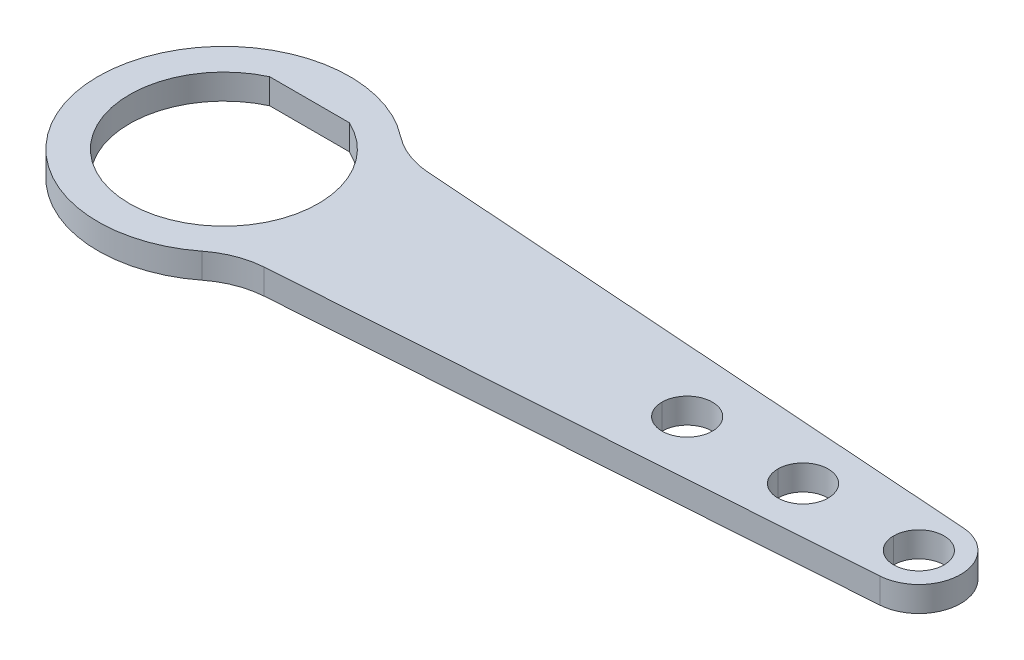
ISO-10303-21;
HEADER;
FILE_DESCRIPTION(('STEP AP214'),'2;1');
FILE_NAME('part.step','',(''),(''),'','','');
FILE_SCHEMA(('AUTOMOTIVE_DESIGN { 1 0 10303 214 1 1 1 1 }'));
ENDSEC;
DATA;
#1=APPLICATION_CONTEXT('core data for automotive mechanical design processes');
#2=APPLICATION_PROTOCOL_DEFINITION('international standard','automotive_design',2000,#1);
#3=PRODUCT_CONTEXT('',#1,'mechanical');
#4=PRODUCT('Part','Part','',(#3));
#5=PRODUCT_RELATED_PRODUCT_CATEGORY('part','',(#4));
#6=PRODUCT_DEFINITION_FORMATION('','',#4);
#7=PRODUCT_DEFINITION_CONTEXT('part definition',#1,'design');
#8=PRODUCT_DEFINITION('design','',#6,#7);
#9=PRODUCT_DEFINITION_SHAPE('','',#8);
#10=(LENGTH_UNIT() NAMED_UNIT(*) SI_UNIT(.MILLI.,.METRE.));
#11=(NAMED_UNIT(*) PLANE_ANGLE_UNIT() SI_UNIT($,.RADIAN.));
#12=(NAMED_UNIT(*) SI_UNIT($,.STERADIAN.) SOLID_ANGLE_UNIT());
#13=UNCERTAINTY_MEASURE_WITH_UNIT(LENGTH_MEASURE(1.E-05),#10,'distance_accuracy_value','');
#14=(GEOMETRIC_REPRESENTATION_CONTEXT(3) GLOBAL_UNCERTAINTY_ASSIGNED_CONTEXT((#13)) GLOBAL_UNIT_ASSIGNED_CONTEXT((#10,
#11,#12)) REPRESENTATION_CONTEXT('',''));
#15=CARTESIAN_POINT('',(0.,0.,0.));
#16=DIRECTION('',(0.,0.,1.));
#17=DIRECTION('',(1.,0.,0.));
#18=AXIS2_PLACEMENT_3D('',#15,#16,#17);
#19=CARTESIAN_POINT('',(70.104,2.54,0.));
#20=DIRECTION('',(0.,-1.,0.));
#21=DIRECTION('',(0.,0.,-1.));
#22=AXIS2_PLACEMENT_3D('',#19,#20,#21);
#23=CYLINDRICAL_SURFACE('',#22,2.54);
#24=CARTESIAN_POINT('',(70.104,2.54,0.));
#25=DIRECTION('',(0.,1.,0.));
#26=DIRECTION('',(0.,0.,1.));
#27=AXIS2_PLACEMENT_3D('',#24,#25,#26);
#28=CIRCLE('',#27,2.54);
#29=CARTESIAN_POINT('',(72.644,2.54,0.));
#30=VERTEX_POINT('',#29);
#31=CARTESIAN_POINT('',(67.564,2.54,0.));
#32=VERTEX_POINT('',#31);
#33=EDGE_CURVE('E187',#30,#32,#28,.T.);
#34=ORIENTED_EDGE('',*,*,#33,.T.);
#35=DIRECTION('',(0.,-1.,0.));
#36=VECTOR('',#35,1.);
#37=CARTESIAN_POINT('',(67.564,2.54,0.));
#38=LINE('',#37,#36);
#39=CARTESIAN_POINT('',(67.564,0.,0.));
#40=VERTEX_POINT('',#39);
#41=EDGE_CURVE('E11',#32,#40,#38,.T.);
#42=ORIENTED_EDGE('',*,*,#41,.T.);
#43=CARTESIAN_POINT('',(70.104,0.,0.));
#44=DIRECTION('',(0.,1.,0.));
#45=DIRECTION('',(0.,0.,1.));
#46=AXIS2_PLACEMENT_3D('',#43,#44,#45);
#47=CIRCLE('',#46,2.54);
#48=CARTESIAN_POINT('',(72.644,0.,0.));
#49=VERTEX_POINT('',#48);
#50=EDGE_CURVE('E192',#49,#40,#47,.T.);
#51=ORIENTED_EDGE('',*,*,#50,.F.);
#52=DIRECTION('',(0.,-1.,0.));
#53=VECTOR('',#52,1.);
#54=CARTESIAN_POINT('',(72.644,2.54,0.));
#55=LINE('',#54,#53);
#56=EDGE_CURVE('E60',#49,#30,#55,.F.);
#57=ORIENTED_EDGE('',*,*,#56,.T.);
#58=EDGE_LOOP('',(#34,#42,#51,#57));
#59=FACE_BOUND('',#58,.T.);
#60=ADVANCED_FACE('F51',(#59),#23,.F.);
#61=CARTESIAN_POINT('',(58.42,2.54,0.));
#62=DIRECTION('',(0.,-1.,0.));
#63=DIRECTION('',(0.,0.,-1.));
#64=AXIS2_PLACEMENT_3D('',#61,#62,#63);
#65=CYLINDRICAL_SURFACE('',#64,2.54);
#66=CARTESIAN_POINT('',(58.42,2.54,0.));
#67=DIRECTION('',(0.,1.,0.));
#68=DIRECTION('',(0.,0.,1.));
#69=AXIS2_PLACEMENT_3D('',#66,#67,#68);
#70=CIRCLE('',#69,2.54);
#71=CARTESIAN_POINT('',(60.96,2.54,0.));
#72=VERTEX_POINT('',#71);
#73=CARTESIAN_POINT('',(55.88,2.54,0.));
#74=VERTEX_POINT('',#73);
#75=EDGE_CURVE('E196',#72,#74,#70,.T.);
#76=ORIENTED_EDGE('',*,*,#75,.T.);
#77=DIRECTION('',(0.,-1.,0.));
#78=VECTOR('',#77,1.);
#79=CARTESIAN_POINT('',(55.88,2.54,0.));
#80=LINE('',#79,#78);
#81=CARTESIAN_POINT('',(55.88,0.,0.));
#82=VERTEX_POINT('',#81);
#83=EDGE_CURVE('E281',#74,#82,#80,.T.);
#84=ORIENTED_EDGE('',*,*,#83,.T.);
#85=CARTESIAN_POINT('',(58.42,0.,0.));
#86=DIRECTION('',(0.,1.,0.));
#87=DIRECTION('',(0.,0.,1.));
#88=AXIS2_PLACEMENT_3D('',#85,#86,#87);
#89=CIRCLE('',#88,2.54);
#90=CARTESIAN_POINT('',(60.96,0.,0.));
#91=VERTEX_POINT('',#90);
#92=EDGE_CURVE('E202',#91,#82,#89,.T.);
#93=ORIENTED_EDGE('',*,*,#92,.F.);
#94=DIRECTION('',(0.,-1.,0.));
#95=VECTOR('',#94,1.);
#96=CARTESIAN_POINT('',(60.96,2.54,0.));
#97=LINE('',#96,#95);
#98=EDGE_CURVE('E278',#91,#72,#97,.F.);
#99=ORIENTED_EDGE('',*,*,#98,.T.);
#100=EDGE_LOOP('',(#76,#84,#93,#99));
#101=FACE_BOUND('',#100,.T.);
#102=ADVANCED_FACE('F371',(#101),#65,.F.);
#103=CARTESIAN_POINT('',(46.736,2.54,0.));
#104=DIRECTION('',(0.,-1.,0.));
#105=DIRECTION('',(0.,0.,-1.));
#106=AXIS2_PLACEMENT_3D('',#103,#104,#105);
#107=CYLINDRICAL_SURFACE('',#106,2.54);
#108=CARTESIAN_POINT('',(46.736,2.54,0.));
#109=DIRECTION('',(0.,1.,0.));
#110=DIRECTION('',(0.,0.,1.));
#111=AXIS2_PLACEMENT_3D('',#108,#109,#110);
#112=CIRCLE('',#111,2.54);
#113=CARTESIAN_POINT('',(49.276,2.54,0.));
#114=VERTEX_POINT('',#113);
#115=CARTESIAN_POINT('',(44.196,2.54,0.));
#116=VERTEX_POINT('',#115);
#117=EDGE_CURVE('E177',#114,#116,#112,.T.);
#118=ORIENTED_EDGE('',*,*,#117,.T.);
#119=DIRECTION('',(0.,-1.,0.));
#120=VECTOR('',#119,1.);
#121=CARTESIAN_POINT('',(44.196,2.54,0.));
#122=LINE('',#121,#120);
#123=CARTESIAN_POINT('',(44.196,0.,0.));
#124=VERTEX_POINT('',#123);
#125=EDGE_CURVE('E275',#116,#124,#122,.T.);
#126=ORIENTED_EDGE('',*,*,#125,.T.);
#127=CARTESIAN_POINT('',(46.736,0.,0.));
#128=DIRECTION('',(0.,1.,0.));
#129=DIRECTION('',(0.,0.,1.));
#130=AXIS2_PLACEMENT_3D('',#127,#128,#129);
#131=CIRCLE('',#130,2.54);
#132=CARTESIAN_POINT('',(49.276,0.,0.));
#133=VERTEX_POINT('',#132);
#134=EDGE_CURVE('E183',#133,#124,#131,.T.);
#135=ORIENTED_EDGE('',*,*,#134,.F.);
#136=DIRECTION('',(0.,-1.,0.));
#137=VECTOR('',#136,1.);
#138=CARTESIAN_POINT('',(49.276,2.54,0.));
#139=LINE('',#138,#137);
#140=EDGE_CURVE('E272',#133,#114,#139,.F.);
#141=ORIENTED_EDGE('',*,*,#140,.T.);
#142=EDGE_LOOP('',(#118,#126,#135,#141));
#143=FACE_BOUND('',#142,.T.);
#144=ADVANCED_FACE('F293',(#143),#107,.F.);
#145=CARTESIAN_POINT('',(12.9091275552743,2.54,-16.523789327436));
#146=DIRECTION('',(0.,-1.,0.));
#147=DIRECTION('',(0.,0.,-1.));
#148=AXIS2_PLACEMENT_3D('',#145,#146,#147);
#149=PLANE('',#148);
#150=ORIENTED_EDGE('',*,*,#117,.F.);
#151=EDGE_CURVE('E182',#116,#114,#112,.T.);
#152=ORIENTED_EDGE('',*,*,#151,.F.);
#153=EDGE_LOOP('',(#150,#152));
#154=FACE_BOUND('',#153,.T.);
#155=ORIENTED_EDGE('',*,*,#33,.F.);
#156=EDGE_CURVE('E191',#32,#30,#28,.T.);
#157=ORIENTED_EDGE('',*,*,#156,.F.);
#158=EDGE_LOOP('',(#155,#157));
#159=FACE_BOUND('',#158,.T.);
#160=ORIENTED_EDGE('',*,*,#75,.F.);
#161=EDGE_CURVE('E201',#74,#72,#70,.T.);
#162=ORIENTED_EDGE('',*,*,#161,.F.);
#163=EDGE_LOOP('',(#160,#162));
#164=FACE_BOUND('',#163,.T.);
#165=CARTESIAN_POINT('',(12.9091275552743,2.54,-16.523789327436));
#166=DIRECTION('',(0.,-1.,0.));
#167=DIRECTION('',(0.,0.,-1.));
#168=AXIS2_PLACEMENT_3D('',#165,#166,#167);
#169=CIRCLE('',#168,8.26857620287629);
#170=CARTESIAN_POINT('',(12.33145930283,2.54,-8.27541665078699));
#171=VERTEX_POINT('',#170);
#172=CARTESIAN_POINT('',(7.81864816980252,2.54,-10.0079338925097));
#173=VERTEX_POINT('',#172);
#174=EDGE_CURVE('E206',#171,#173,#169,.T.);
#175=ORIENTED_EDGE('',*,*,#174,.T.);
#176=CARTESIAN_POINT('',(0.,2.54,0.));
#177=DIRECTION('',(0.,1.,0.));
#178=DIRECTION('',(0.,0.,-1.));
#179=AXIS2_PLACEMENT_3D('',#176,#177,#178);
#180=CIRCLE('',#179,12.7);
#181=CARTESIAN_POINT('',(7.81864816980252,2.54,10.0079338925097));
#182=VERTEX_POINT('',#181);
#183=EDGE_CURVE('E210',#173,#182,#180,.T.);
#184=ORIENTED_EDGE('',*,*,#183,.T.);
#185=CARTESIAN_POINT('',(12.9091275552743,2.54,16.523789327436));
#186=DIRECTION('',(0.,-1.,0.));
#187=DIRECTION('',(0.,0.,1.));
#188=AXIS2_PLACEMENT_3D('',#185,#186,#187);
#189=CIRCLE('',#188,8.26857620287629);
#190=CARTESIAN_POINT('',(12.33145930283,2.54,8.27541665078699));
#191=VERTEX_POINT('',#190);
#192=EDGE_CURVE('E214',#182,#191,#189,.T.);
#193=ORIENTED_EDGE('',*,*,#192,.T.);
#194=DIRECTION('',(0.997556589462132,0.,-0.0698630862521835));
#195=VECTOR('',#194,1.);
#196=CARTESIAN_POINT('',(70.3987543461835,2.54,4.20871959830985));
#197=LINE('',#196,#195);
#198=CARTESIAN_POINT('',(70.3987543461835,2.54,4.20871959830985));
#199=VERTEX_POINT('',#198);
#200=EDGE_CURVE('E217',#191,#199,#197,.T.);
#201=ORIENTED_EDGE('',*,*,#200,.T.);
#202=CARTESIAN_POINT('',(70.104,2.54,0.));
#203=DIRECTION('',(0.,1.,0.));
#204=DIRECTION('',(0.,0.,-1.));
#205=AXIS2_PLACEMENT_3D('',#202,#203,#204);
#206=CIRCLE('',#205,4.21902841680303);
#207=CARTESIAN_POINT('',(70.3987543461835,2.54,-4.20871959830985));
#208=VERTEX_POINT('',#207);
#209=EDGE_CURVE('E220',#199,#208,#206,.T.);
#210=ORIENTED_EDGE('',*,*,#209,.T.);
#211=DIRECTION('',(-0.997556589462132,0.,-0.0698630862521835));
#212=VECTOR('',#211,1.);
#213=CARTESIAN_POINT('',(70.3987543461835,2.54,-4.20871959830985));
#214=LINE('',#213,#212);
#215=EDGE_CURVE('E223',#208,#171,#214,.T.);
#216=ORIENTED_EDGE('',*,*,#215,.T.);
#217=EDGE_LOOP('',(#175,#184,#193,#201,#210,#216));
#218=FACE_BOUND('',#217,.T.);
#219=CARTESIAN_POINT('',(0.,2.54,0.));
#220=DIRECTION('',(0.,1.,0.));
#221=DIRECTION('',(0.,0.,-1.));
#222=AXIS2_PLACEMENT_3D('',#219,#220,#221);
#223=CIRCLE('',#222,9.525);
#224=CARTESIAN_POINT('',(-4.01810017296732,2.54,-8.636));
#225=VERTEX_POINT('',#224);
#226=CARTESIAN_POINT('',(4.01810017296732,2.54,-8.636));
#227=VERTEX_POINT('',#226);
#228=EDGE_CURVE('E161',#225,#227,#223,.T.);
#229=ORIENTED_EDGE('',*,*,#228,.F.);
#230=DIRECTION('',(-1.,0.,0.));
#231=VECTOR('',#230,1.);
#232=CARTESIAN_POINT('',(-4.01810017296732,2.54,-8.636));
#233=LINE('',#232,#231);
#234=EDGE_CURVE('E150',#227,#225,#233,.T.);
#235=ORIENTED_EDGE('',*,*,#234,.F.);
#236=EDGE_LOOP('',(#229,#235));
#237=FACE_BOUND('',#236,.T.);
#238=ADVANCED_FACE('F170',(#154,#159,#164,#218,#237),#149,.F.);
#239=CARTESIAN_POINT('',(12.9091275552743,0.,-16.523789327436));
#240=DIRECTION('',(0.,-1.,0.));
#241=DIRECTION('',(0.,0.,-1.));
#242=AXIS2_PLACEMENT_3D('',#239,#240,#241);
#243=PLANE('',#242);
#244=ORIENTED_EDGE('',*,*,#50,.T.);
#245=EDGE_CURVE('E181',#40,#49,#47,.T.);
#246=ORIENTED_EDGE('',*,*,#245,.T.);
#247=EDGE_LOOP('',(#244,#246));
#248=FACE_BOUND('',#247,.T.);
#249=CARTESIAN_POINT('',(12.9091275552743,0.,-16.523789327436));
#250=DIRECTION('',(0.,-1.,0.));
#251=DIRECTION('',(0.,0.,-1.));
#252=AXIS2_PLACEMENT_3D('',#249,#250,#251);
#253=CIRCLE('',#252,8.26857620287629);
#254=CARTESIAN_POINT('',(12.33145930283,0.,-8.27541665078699));
#255=VERTEX_POINT('',#254);
#256=CARTESIAN_POINT('',(7.81864816980252,0.,-10.0079338925097));
#257=VERTEX_POINT('',#256);
#258=EDGE_CURVE('E200',#255,#257,#253,.T.);
#259=ORIENTED_EDGE('',*,*,#258,.F.);
#260=DIRECTION('',(-0.997556589462132,0.,-0.0698630862521835));
#261=VECTOR('',#260,1.);
#262=CARTESIAN_POINT('',(70.3987543461835,0.,-4.20871959830985));
#263=LINE('',#262,#261);
#264=CARTESIAN_POINT('',(70.3987543461835,0.,-4.20871959830985));
#265=VERTEX_POINT('',#264);
#266=EDGE_CURVE('E211',#265,#255,#263,.T.);
#267=ORIENTED_EDGE('',*,*,#266,.F.);
#268=CARTESIAN_POINT('',(70.104,0.,0.));
#269=DIRECTION('',(0.,1.,0.));
#270=DIRECTION('',(0.,0.,-1.));
#271=AXIS2_PLACEMENT_3D('',#268,#269,#270);
#272=CIRCLE('',#271,4.21902841680303);
#273=CARTESIAN_POINT('',(70.3987543461835,0.,4.20871959830985));
#274=VERTEX_POINT('',#273);
#275=EDGE_CURVE('E239',#274,#265,#272,.T.);
#276=ORIENTED_EDGE('',*,*,#275,.F.);
#277=DIRECTION('',(0.997556589462132,0.,-0.0698630862521835));
#278=VECTOR('',#277,1.);
#279=CARTESIAN_POINT('',(70.3987543461835,0.,4.20871959830985));
#280=LINE('',#279,#278);
#281=CARTESIAN_POINT('',(12.33145930283,0.,8.27541665078699));
#282=VERTEX_POINT('',#281);
#283=EDGE_CURVE('E236',#282,#274,#280,.T.);
#284=ORIENTED_EDGE('',*,*,#283,.F.);
#285=CARTESIAN_POINT('',(12.9091275552743,0.,16.523789327436));
#286=DIRECTION('',(0.,-1.,0.));
#287=DIRECTION('',(0.,0.,1.));
#288=AXIS2_PLACEMENT_3D('',#285,#286,#287);
#289=CIRCLE('',#288,8.26857620287629);
#290=CARTESIAN_POINT('',(7.81864816980252,0.,10.0079338925097));
#291=VERTEX_POINT('',#290);
#292=EDGE_CURVE('E233',#291,#282,#289,.T.);
#293=ORIENTED_EDGE('',*,*,#292,.F.);
#294=CARTESIAN_POINT('',(0.,0.,0.));
#295=DIRECTION('',(0.,1.,0.));
#296=DIRECTION('',(0.,0.,-1.));
#297=AXIS2_PLACEMENT_3D('',#294,#295,#296);
#298=CIRCLE('',#297,12.7);
#299=EDGE_CURVE('E230',#257,#291,#298,.T.);
#300=ORIENTED_EDGE('',*,*,#299,.F.);
#301=EDGE_LOOP('',(#259,#267,#276,#284,#293,#300));
#302=FACE_BOUND('',#301,.T.);
#303=ORIENTED_EDGE('',*,*,#92,.T.);
#304=EDGE_CURVE('E190',#82,#91,#89,.T.);
#305=ORIENTED_EDGE('',*,*,#304,.T.);
#306=EDGE_LOOP('',(#303,#305));
#307=FACE_BOUND('',#306,.T.);
#308=ORIENTED_EDGE('',*,*,#134,.T.);
#309=EDGE_CURVE('E175',#124,#133,#131,.T.);
#310=ORIENTED_EDGE('',*,*,#309,.T.);
#311=EDGE_LOOP('',(#308,#310));
#312=FACE_BOUND('',#311,.T.);
#313=DIRECTION('',(1.,0.,0.));
#314=VECTOR('',#313,1.);
#315=CARTESIAN_POINT('',(12.9091275552743,0.,-8.636));
#316=LINE('',#315,#314);
#317=CARTESIAN_POINT('',(4.01810017296732,0.,-8.636));
#318=VERTEX_POINT('',#317);
#319=CARTESIAN_POINT('',(-4.01810017296732,0.,-8.636));
#320=VERTEX_POINT('',#319);
#321=EDGE_CURVE('E267',#318,#320,#316,.F.);
#322=ORIENTED_EDGE('',*,*,#321,.T.);
#323=CARTESIAN_POINT('',(0.,0.,0.));
#324=DIRECTION('',(0.,-1.,0.));
#325=DIRECTION('',(0.,0.,-1.));
#326=AXIS2_PLACEMENT_3D('',#323,#324,#325);
#327=CIRCLE('',#326,9.525);
#328=EDGE_CURVE('E166',#320,#318,#327,.F.);
#329=ORIENTED_EDGE('',*,*,#328,.T.);
#330=EDGE_LOOP('',(#322,#329));
#331=FACE_BOUND('',#330,.T.);
#332=ADVANCED_FACE('F292',(#248,#302,#307,#312,#331),#243,.T.);
#333=CARTESIAN_POINT('',(12.9091275552743,2.54,-16.523789327436));
#334=DIRECTION('',(0.,-1.,0.));
#335=DIRECTION('',(0.,0.,-1.));
#336=AXIS2_PLACEMENT_3D('',#333,#334,#335);
#337=CYLINDRICAL_SURFACE('',#336,8.26857620287629);
#338=ORIENTED_EDGE('',*,*,#258,.T.);
#339=DIRECTION('',(0.,-1.,0.));
#340=VECTOR('',#339,1.);
#341=CARTESIAN_POINT('',(7.81864816980252,2.54,-10.0079338925097));
#342=LINE('',#341,#340);
#343=EDGE_CURVE('E263',#173,#257,#342,.T.);
#344=ORIENTED_EDGE('',*,*,#343,.F.);
#345=ORIENTED_EDGE('',*,*,#174,.F.);
#346=DIRECTION('',(0.,-1.,0.));
#347=VECTOR('',#346,1.);
#348=CARTESIAN_POINT('',(12.33145930283,2.54,-8.27541665078699));
#349=LINE('',#348,#347);
#350=EDGE_CURVE('E226',#171,#255,#349,.T.);
#351=ORIENTED_EDGE('',*,*,#350,.T.);
#352=EDGE_LOOP('',(#338,#344,#345,#351));
#353=FACE_BOUND('',#352,.T.);
#354=ADVANCED_FACE('F53',(#353),#337,.F.);
#355=CARTESIAN_POINT('',(0.,2.54,0.));
#356=DIRECTION('',(0.,-1.,0.));
#357=DIRECTION('',(0.,0.,-1.));
#358=AXIS2_PLACEMENT_3D('',#355,#356,#357);
#359=CYLINDRICAL_SURFACE('',#358,12.7);
#360=ORIENTED_EDGE('',*,*,#299,.T.);
#361=DIRECTION('',(0.,-1.,0.));
#362=VECTOR('',#361,1.);
#363=CARTESIAN_POINT('',(7.81864816980252,2.54,10.0079338925097));
#364=LINE('',#363,#362);
#365=EDGE_CURVE('E259',#182,#291,#364,.T.);
#366=ORIENTED_EDGE('',*,*,#365,.F.);
#367=ORIENTED_EDGE('',*,*,#183,.F.);
#368=ORIENTED_EDGE('',*,*,#343,.T.);
#369=EDGE_LOOP('',(#360,#366,#367,#368));
#370=FACE_BOUND('',#369,.T.);
#371=ADVANCED_FACE('F307',(#370),#359,.T.);
#372=CARTESIAN_POINT('',(12.9091275552743,2.54,16.523789327436));
#373=DIRECTION('',(0.,-1.,0.));
#374=DIRECTION('',(0.,0.,-1.));
#375=AXIS2_PLACEMENT_3D('',#372,#373,#374);
#376=CYLINDRICAL_SURFACE('',#375,8.26857620287629);
#377=ORIENTED_EDGE('',*,*,#292,.T.);
#378=DIRECTION('',(0.,-1.,0.));
#379=VECTOR('',#378,1.);
#380=CARTESIAN_POINT('',(12.33145930283,2.54,8.27541665078699));
#381=LINE('',#380,#379);
#382=EDGE_CURVE('E255',#191,#282,#381,.T.);
#383=ORIENTED_EDGE('',*,*,#382,.F.);
#384=ORIENTED_EDGE('',*,*,#192,.F.);
#385=ORIENTED_EDGE('',*,*,#365,.T.);
#386=EDGE_LOOP('',(#377,#383,#384,#385));
#387=FACE_BOUND('',#386,.T.);
#388=ADVANCED_FACE('F312',(#387),#376,.F.);
#389=CARTESIAN_POINT('',(70.3987543461835,2.54,4.20871959830985));
#390=DIRECTION('',(-0.0698630862521835,0.,-0.997556589462132));
#391=DIRECTION('',(-0.997556589462132,0.,0.0698630862521835));
#392=AXIS2_PLACEMENT_3D('',#389,#390,#391);
#393=PLANE('',#392);
#394=ORIENTED_EDGE('',*,*,#283,.T.);
#395=DIRECTION('',(0.,-1.,0.));
#396=VECTOR('',#395,1.);
#397=CARTESIAN_POINT('',(70.3987543461835,2.54,4.20871959830985));
#398=LINE('',#397,#396);
#399=EDGE_CURVE('E251',#199,#274,#398,.T.);
#400=ORIENTED_EDGE('',*,*,#399,.F.);
#401=ORIENTED_EDGE('',*,*,#200,.F.);
#402=ORIENTED_EDGE('',*,*,#382,.T.);
#403=EDGE_LOOP('',(#394,#400,#401,#402));
#404=FACE_BOUND('',#403,.T.);
#405=ADVANCED_FACE('F318',(#404),#393,.F.);
#406=CARTESIAN_POINT('',(70.104,2.54,0.));
#407=DIRECTION('',(0.,-1.,0.));
#408=DIRECTION('',(0.,0.,-1.));
#409=AXIS2_PLACEMENT_3D('',#406,#407,#408);
#410=CYLINDRICAL_SURFACE('',#409,4.21902841680303);
#411=ORIENTED_EDGE('',*,*,#275,.T.);
#412=DIRECTION('',(0.,-1.,0.));
#413=VECTOR('',#412,1.);
#414=CARTESIAN_POINT('',(70.3987543461835,2.54,-4.20871959830985));
#415=LINE('',#414,#413);
#416=EDGE_CURVE('E247',#208,#265,#415,.T.);
#417=ORIENTED_EDGE('',*,*,#416,.F.);
#418=ORIENTED_EDGE('',*,*,#209,.F.);
#419=ORIENTED_EDGE('',*,*,#399,.T.);
#420=EDGE_LOOP('',(#411,#417,#418,#419));
#421=FACE_BOUND('',#420,.T.);
#422=ADVANCED_FACE('F322',(#421),#410,.T.);
#423=CARTESIAN_POINT('',(70.3987543461835,2.54,-4.20871959830985));
#424=DIRECTION('',(-0.0698630862521835,0.,0.997556589462132));
#425=DIRECTION('',(0.997556589462132,0.,0.0698630862521835));
#426=AXIS2_PLACEMENT_3D('',#423,#424,#425);
#427=PLANE('',#426);
#428=ORIENTED_EDGE('',*,*,#266,.T.);
#429=ORIENTED_EDGE('',*,*,#350,.F.);
#430=ORIENTED_EDGE('',*,*,#215,.F.);
#431=ORIENTED_EDGE('',*,*,#416,.T.);
#432=EDGE_LOOP('',(#428,#429,#430,#431));
#433=FACE_BOUND('',#432,.T.);
#434=ADVANCED_FACE('F325',(#433),#427,.F.);
#435=ORIENTED_EDGE('',*,*,#83,.F.);
#436=ORIENTED_EDGE('',*,*,#161,.T.);
#437=ORIENTED_EDGE('',*,*,#98,.F.);
#438=ORIENTED_EDGE('',*,*,#304,.F.);
#439=EDGE_LOOP('',(#435,#436,#437,#438));
#440=FACE_BOUND('',#439,.T.);
#441=ADVANCED_FACE('F368',(#440),#65,.F.);
#442=ORIENTED_EDGE('',*,*,#41,.F.);
#443=ORIENTED_EDGE('',*,*,#156,.T.);
#444=ORIENTED_EDGE('',*,*,#56,.F.);
#445=ORIENTED_EDGE('',*,*,#245,.F.);
#446=EDGE_LOOP('',(#442,#443,#444,#445));
#447=FACE_BOUND('',#446,.T.);
#448=ADVANCED_FACE('F287',(#447),#23,.F.);
#449=ORIENTED_EDGE('',*,*,#125,.F.);
#450=ORIENTED_EDGE('',*,*,#151,.T.);
#451=ORIENTED_EDGE('',*,*,#140,.F.);
#452=ORIENTED_EDGE('',*,*,#309,.F.);
#453=EDGE_LOOP('',(#449,#450,#451,#452));
#454=FACE_BOUND('',#453,.T.);
#455=ADVANCED_FACE('F343',(#454),#107,.F.);
#456=CARTESIAN_POINT('',(0.,2.54,0.));
#457=DIRECTION('',(0.,-1.,0.));
#458=DIRECTION('',(0.,0.,-1.));
#459=AXIS2_PLACEMENT_3D('',#456,#457,#458);
#460=CYLINDRICAL_SURFACE('',#459,9.525);
#461=DIRECTION('',(0.,-1.,0.));
#462=VECTOR('',#461,1.);
#463=CARTESIAN_POINT('',(-4.01810017296732,2.54,-8.636));
#464=LINE('',#463,#462);
#465=EDGE_CURVE('E153',#225,#320,#464,.T.);
#466=ORIENTED_EDGE('',*,*,#465,.F.);
#467=ORIENTED_EDGE('',*,*,#228,.T.);
#468=DIRECTION('',(0.,-1.,0.));
#469=VECTOR('',#468,1.);
#470=CARTESIAN_POINT('',(4.01810017296732,2.54,-8.636));
#471=LINE('',#470,#469);
#472=EDGE_CURVE('E156',#227,#318,#471,.T.);
#473=ORIENTED_EDGE('',*,*,#472,.T.);
#474=ORIENTED_EDGE('',*,*,#328,.F.);
#475=EDGE_LOOP('',(#466,#467,#473,#474));
#476=FACE_BOUND('',#475,.T.);
#477=ADVANCED_FACE('F164',(#476),#460,.F.);
#478=CARTESIAN_POINT('',(-4.01810017296732,2.54,-8.636));
#479=DIRECTION('',(0.,0.,1.));
#480=DIRECTION('',(1.,0.,0.));
#481=AXIS2_PLACEMENT_3D('',#478,#479,#480);
#482=PLANE('',#481);
#483=ORIENTED_EDGE('',*,*,#472,.F.);
#484=ORIENTED_EDGE('',*,*,#234,.T.);
#485=ORIENTED_EDGE('',*,*,#465,.T.);
#486=ORIENTED_EDGE('',*,*,#321,.F.);
#487=EDGE_LOOP('',(#483,#484,#485,#486));
#488=FACE_BOUND('',#487,.T.);
#489=ADVANCED_FACE('F152',(#488),#482,.T.);
#490=CLOSED_SHELL('',(#60,#102,#144,#238,#332,#354,#371,#388,#405,#422,#434,#441,#448,#455,#477,#489));
#491=MANIFOLD_SOLID_BREP('B2',#490);
#492=ADVANCED_BREP_SHAPE_REPRESENTATION('',(#18,#491),#14);
#493=SHAPE_DEFINITION_REPRESENTATION(#9,#492);
ENDSEC;
END-ISO-10303-21;
